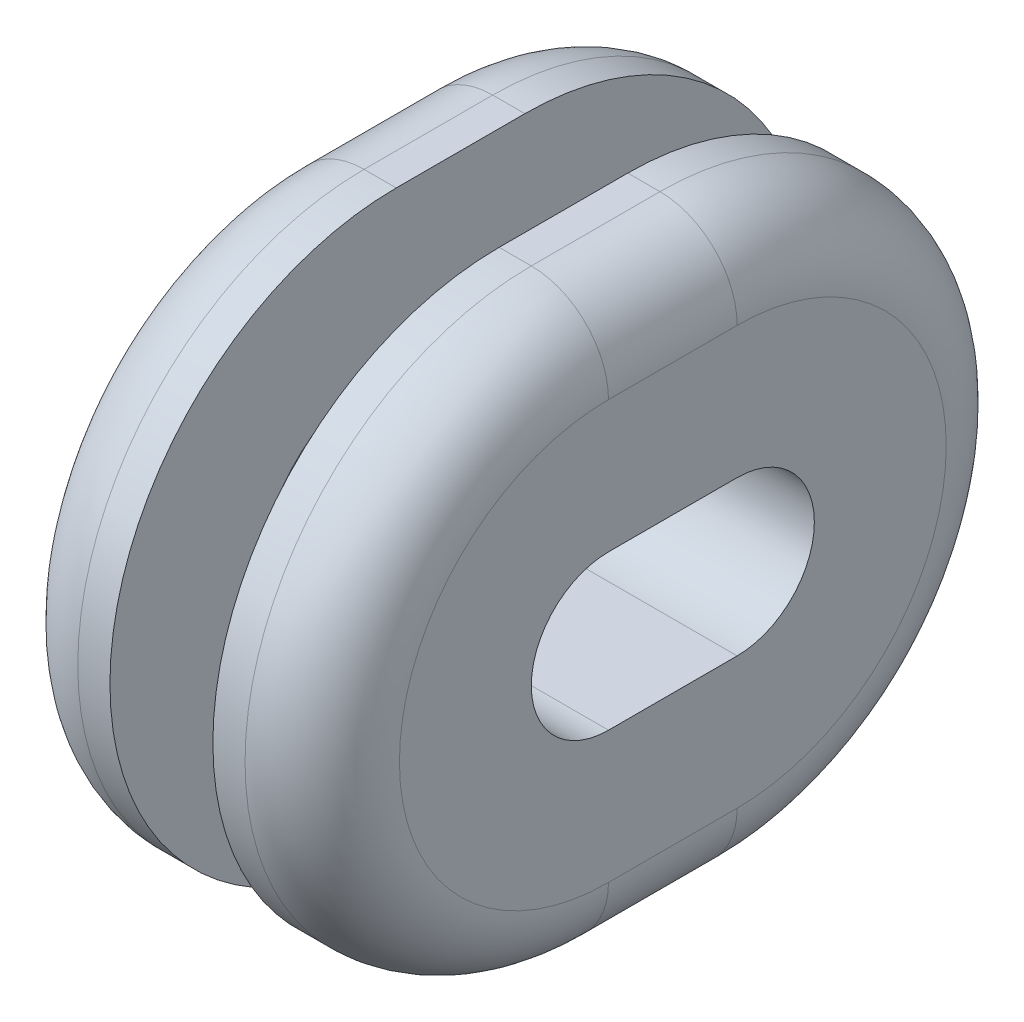
ISO-10303-21;
HEADER;
FILE_DESCRIPTION(('STEP AP214'),'2;1');
FILE_NAME('part.step','',(''),(''),'','','');
FILE_SCHEMA(('AUTOMOTIVE_DESIGN { 1 0 10303 214 1 1 1 1 }'));
ENDSEC;
DATA;
#1=APPLICATION_CONTEXT('core data for automotive mechanical design processes');
#2=APPLICATION_PROTOCOL_DEFINITION('international standard','automotive_design',2000,#1);
#3=PRODUCT_CONTEXT('',#1,'mechanical');
#4=PRODUCT('Part','Part','',(#3));
#5=PRODUCT_RELATED_PRODUCT_CATEGORY('part','',(#4));
#6=PRODUCT_DEFINITION_FORMATION('','',#4);
#7=PRODUCT_DEFINITION_CONTEXT('part definition',#1,'design');
#8=PRODUCT_DEFINITION('design','',#6,#7);
#9=PRODUCT_DEFINITION_SHAPE('','',#8);
#10=(LENGTH_UNIT() NAMED_UNIT(*) SI_UNIT(.MILLI.,.METRE.));
#11=(NAMED_UNIT(*) PLANE_ANGLE_UNIT() SI_UNIT($,.RADIAN.));
#12=(NAMED_UNIT(*) SI_UNIT($,.STERADIAN.) SOLID_ANGLE_UNIT());
#13=UNCERTAINTY_MEASURE_WITH_UNIT(LENGTH_MEASURE(1.E-05),#10,'distance_accuracy_value','');
#14=(GEOMETRIC_REPRESENTATION_CONTEXT(3) GLOBAL_UNCERTAINTY_ASSIGNED_CONTEXT((#13)) GLOBAL_UNIT_ASSIGNED_CONTEXT((#10,
#11,#12)) REPRESENTATION_CONTEXT('',''));
#15=CARTESIAN_POINT('',(0.,0.,0.));
#16=DIRECTION('',(0.,0.,1.));
#17=DIRECTION('',(1.,0.,0.));
#18=AXIS2_PLACEMENT_3D('',#15,#16,#17);
#19=CARTESIAN_POINT('',(0.,-1.2,-1.));
#20=DIRECTION('',(1.,0.,0.));
#21=DIRECTION('',(0.,0.,-1.));
#22=AXIS2_PLACEMENT_3D('',#19,#20,#21);
#23=CYLINDRICAL_SURFACE('',#22,4.45);
#24=DIRECTION('',(-1.,0.,0.));
#25=VECTOR('',#24,1.);
#26=CARTESIAN_POINT('',(-0.8,-5.65,-1.));
#27=LINE('',#26,#25);
#28=CARTESIAN_POINT('',(-0.8,-5.65,-1.));
#29=VERTEX_POINT('',#28);
#30=CARTESIAN_POINT('',(-1.3,-5.65,-1.));
#31=VERTEX_POINT('',#30);
#32=EDGE_CURVE('E368',#29,#31,#27,.T.);
#33=ORIENTED_EDGE('',*,*,#32,.T.);
#34=CARTESIAN_POINT('',(-1.3,-1.2,-1.));
#35=DIRECTION('',(1.,0.,0.));
#36=DIRECTION('',(0.,1.,0.));
#37=AXIS2_PLACEMENT_3D('',#34,#35,#36);
#38=CIRCLE('',#37,4.45);
#39=CARTESIAN_POINT('',(-1.3,3.25,-0.999999999999938));
#40=VERTEX_POINT('',#39);
#41=EDGE_CURVE('E42',#31,#40,#38,.T.);
#42=ORIENTED_EDGE('',*,*,#41,.T.);
#43=DIRECTION('',(-1.,0.,0.));
#44=VECTOR('',#43,1.);
#45=CARTESIAN_POINT('',(-0.8,3.25,-0.999999999999938));
#46=LINE('',#45,#44);
#47=CARTESIAN_POINT('',(-0.8,3.25,-0.999999999999938));
#48=VERTEX_POINT('',#47);
#49=EDGE_CURVE('E329',#48,#40,#46,.T.);
#50=ORIENTED_EDGE('',*,*,#49,.F.);
#51=CARTESIAN_POINT('',(-0.8,-1.2,-1.));
#52=DIRECTION('',(1.,0.,0.));
#53=DIRECTION('',(0.,0.,-1.));
#54=AXIS2_PLACEMENT_3D('',#51,#52,#53);
#55=CIRCLE('',#54,4.45);
#56=EDGE_CURVE('E198',#29,#48,#55,.T.);
#57=ORIENTED_EDGE('',*,*,#56,.F.);
#58=EDGE_LOOP('',(#33,#42,#50,#57));
#59=FACE_BOUND('',#58,.T.);
#60=ADVANCED_FACE('F33',(#59),#23,.T.);
#61=CARTESIAN_POINT('',(0.,-1.2,-1.));
#62=DIRECTION('',(1.,0.,0.));
#63=DIRECTION('',(0.,0.,-1.));
#64=AXIS2_PLACEMENT_3D('',#61,#62,#63);
#65=CYLINDRICAL_SURFACE('',#64,1.2);
#66=DIRECTION('',(1.,0.,0.));
#67=VECTOR('',#66,1.);
#68=CARTESIAN_POINT('',(-2.5,-2.4,-1.));
#69=LINE('',#68,#67);
#70=CARTESIAN_POINT('',(-2.5,-2.4,-1.));
#71=VERTEX_POINT('',#70);
#72=CARTESIAN_POINT('',(2.5,-2.4,-1.));
#73=VERTEX_POINT('',#72);
#74=EDGE_CURVE('E334',#71,#73,#69,.T.);
#75=ORIENTED_EDGE('',*,*,#74,.T.);
#76=CARTESIAN_POINT('',(2.5,-1.2,-1.));
#77=DIRECTION('',(1.,0.,0.));
#78=DIRECTION('',(0.,0.,-1.));
#79=AXIS2_PLACEMENT_3D('',#76,#77,#78);
#80=CIRCLE('',#79,1.2);
#81=CARTESIAN_POINT('',(2.5,0.,-0.999999999999983));
#82=VERTEX_POINT('',#81);
#83=EDGE_CURVE('E317',#73,#82,#80,.T.);
#84=ORIENTED_EDGE('',*,*,#83,.T.);
#85=DIRECTION('',(1.,0.,0.));
#86=VECTOR('',#85,1.);
#87=CARTESIAN_POINT('',(-2.5,0.,-0.999999999999983));
#88=LINE('',#87,#86);
#89=CARTESIAN_POINT('',(-2.5,0.,-0.999999999999983));
#90=VERTEX_POINT('',#89);
#91=EDGE_CURVE('E325',#90,#82,#88,.T.);
#92=ORIENTED_EDGE('',*,*,#91,.F.);
#93=CARTESIAN_POINT('',(-2.5,-1.2,-1.));
#94=DIRECTION('',(1.,0.,0.));
#95=DIRECTION('',(0.,0.,-1.));
#96=AXIS2_PLACEMENT_3D('',#93,#94,#95);
#97=CIRCLE('',#96,1.2);
#98=EDGE_CURVE('E336',#71,#90,#97,.T.);
#99=ORIENTED_EDGE('',*,*,#98,.F.);
#100=EDGE_LOOP('',(#75,#84,#92,#99));
#101=FACE_BOUND('',#100,.T.);
#102=ADVANCED_FACE('F332',(#101),#65,.F.);
#103=CARTESIAN_POINT('',(0.,-1.2,-1.));
#104=DIRECTION('',(1.,0.,0.));
#105=DIRECTION('',(0.,0.,-1.));
#106=AXIS2_PLACEMENT_3D('',#103,#104,#105);
#107=CYLINDRICAL_SURFACE('',#106,4.45);
#108=DIRECTION('',(-1.,0.,0.));
#109=VECTOR('',#108,1.);
#110=CARTESIAN_POINT('',(0.8,3.25,-0.999999999999938));
#111=LINE('',#110,#109);
#112=CARTESIAN_POINT('',(1.3,3.25,-0.999999999999938));
#113=VERTEX_POINT('',#112);
#114=CARTESIAN_POINT('',(0.8,3.25,-0.999999999999938));
#115=VERTEX_POINT('',#114);
#116=EDGE_CURVE('E330',#113,#115,#111,.T.);
#117=ORIENTED_EDGE('',*,*,#116,.F.);
#118=CARTESIAN_POINT('',(1.3,-1.2,-1.));
#119=DIRECTION('',(-1.,0.,0.));
#120=DIRECTION('',(0.,-1.,0.));
#121=AXIS2_PLACEMENT_3D('',#118,#119,#120);
#122=CIRCLE('',#121,4.45);
#123=CARTESIAN_POINT('',(1.3,-5.65,-1.));
#124=VERTEX_POINT('',#123);
#125=EDGE_CURVE('E55',#113,#124,#122,.T.);
#126=ORIENTED_EDGE('',*,*,#125,.T.);
#127=DIRECTION('',(-1.,0.,0.));
#128=VECTOR('',#127,1.);
#129=CARTESIAN_POINT('',(0.8,-5.65,-1.));
#130=LINE('',#129,#128);
#131=CARTESIAN_POINT('',(0.8,-5.65,-1.));
#132=VERTEX_POINT('',#131);
#133=EDGE_CURVE('E295',#124,#132,#130,.T.);
#134=ORIENTED_EDGE('',*,*,#133,.T.);
#135=CARTESIAN_POINT('',(0.8,-1.2,-1.));
#136=DIRECTION('',(1.,0.,0.));
#137=DIRECTION('',(0.,0.,-1.));
#138=AXIS2_PLACEMENT_3D('',#135,#136,#137);
#139=CIRCLE('',#138,4.45);
#140=EDGE_CURVE('E337',#132,#115,#139,.T.);
#141=ORIENTED_EDGE('',*,*,#140,.T.);
#142=EDGE_LOOP('',(#117,#126,#134,#141));
#143=FACE_BOUND('',#142,.T.);
#144=ADVANCED_FACE('F417',(#143),#107,.T.);
#145=CARTESIAN_POINT('',(0.,-1.2,-1.));
#146=DIRECTION('',(1.,0.,0.));
#147=DIRECTION('',(0.,0.,-1.));
#148=AXIS2_PLACEMENT_3D('',#145,#146,#147);
#149=CYLINDRICAL_SURFACE('',#148,2.2);
#150=DIRECTION('',(-1.,0.,0.));
#151=VECTOR('',#150,1.);
#152=CARTESIAN_POINT('',(-0.8,-3.4,-1.));
#153=LINE('',#152,#151);
#154=CARTESIAN_POINT('',(0.8,-3.4,-1.));
#155=VERTEX_POINT('',#154);
#156=CARTESIAN_POINT('',(-0.8,-3.4,-1.));
#157=VERTEX_POINT('',#156);
#158=EDGE_CURVE('E182',#155,#157,#153,.T.);
#159=ORIENTED_EDGE('',*,*,#158,.T.);
#160=CARTESIAN_POINT('',(-0.8,-1.2,-1.));
#161=DIRECTION('',(1.,0.,0.));
#162=DIRECTION('',(0.,0.,-1.));
#163=AXIS2_PLACEMENT_3D('',#160,#161,#162);
#164=CIRCLE('',#163,2.2);
#165=CARTESIAN_POINT('',(-0.8,1.,-0.999999999999969));
#166=VERTEX_POINT('',#165);
#167=EDGE_CURVE('E345',#157,#166,#164,.T.);
#168=ORIENTED_EDGE('',*,*,#167,.T.);
#169=DIRECTION('',(-1.,0.,0.));
#170=VECTOR('',#169,1.);
#171=CARTESIAN_POINT('',(-0.8,1.,-0.999999999999969));
#172=LINE('',#171,#170);
#173=CARTESIAN_POINT('',(0.8,1.,-0.999999999999969));
#174=VERTEX_POINT('',#173);
#175=EDGE_CURVE('E350',#174,#166,#172,.T.);
#176=ORIENTED_EDGE('',*,*,#175,.F.);
#177=CARTESIAN_POINT('',(0.8,-1.2,-1.));
#178=DIRECTION('',(1.,0.,0.));
#179=DIRECTION('',(0.,0.,-1.));
#180=AXIS2_PLACEMENT_3D('',#177,#178,#179);
#181=CIRCLE('',#180,2.2);
#182=EDGE_CURVE('E340',#155,#174,#181,.T.);
#183=ORIENTED_EDGE('',*,*,#182,.F.);
#184=EDGE_LOOP('',(#159,#168,#176,#183));
#185=FACE_BOUND('',#184,.T.);
#186=ADVANCED_FACE('F408',(#185),#149,.T.);
#187=CARTESIAN_POINT('',(-0.8,-5.65,1.));
#188=DIRECTION('',(0.,-1.,0.));
#189=DIRECTION('',(0.,0.,-1.));
#190=AXIS2_PLACEMENT_3D('',#187,#188,#189);
#191=PLANE('',#190);
#192=DIRECTION('',(-1.,0.,0.));
#193=VECTOR('',#192,1.);
#194=CARTESIAN_POINT('',(-0.8,-5.65,1.));
#195=LINE('',#194,#193);
#196=CARTESIAN_POINT('',(-0.8,-5.65,1.));
#197=VERTEX_POINT('',#196);
#198=CARTESIAN_POINT('',(-1.3,-5.65,1.));
#199=VERTEX_POINT('',#198);
#200=EDGE_CURVE('E178',#197,#199,#195,.T.);
#201=ORIENTED_EDGE('',*,*,#200,.T.);
#202=DIRECTION('',(0.,0.,-1.));
#203=VECTOR('',#202,1.);
#204=CARTESIAN_POINT('',(-1.3,-5.65,-0.999999999999999));
#205=LINE('',#204,#203);
#206=EDGE_CURVE('E231',#199,#31,#205,.T.);
#207=ORIENTED_EDGE('',*,*,#206,.T.);
#208=ORIENTED_EDGE('',*,*,#32,.F.);
#209=DIRECTION('',(0.,0.,-1.));
#210=VECTOR('',#209,1.);
#211=CARTESIAN_POINT('',(-0.8,-5.65,1.));
#212=LINE('',#211,#210);
#213=EDGE_CURVE('E353',#197,#29,#212,.T.);
#214=ORIENTED_EDGE('',*,*,#213,.F.);
#215=EDGE_LOOP('',(#201,#207,#208,#214));
#216=FACE_BOUND('',#215,.T.);
#217=ADVANCED_FACE('F400',(#216),#191,.T.);
#218=CARTESIAN_POINT('',(-2.5,-2.4,1.));
#219=DIRECTION('',(0.,1.,0.));
#220=DIRECTION('',(0.,0.,1.));
#221=AXIS2_PLACEMENT_3D('',#218,#219,#220);
#222=PLANE('',#221);
#223=DIRECTION('',(1.,0.,0.));
#224=VECTOR('',#223,1.);
#225=CARTESIAN_POINT('',(-2.5,-2.4,1.));
#226=LINE('',#225,#224);
#227=CARTESIAN_POINT('',(-2.5,-2.4,1.));
#228=VERTEX_POINT('',#227);
#229=CARTESIAN_POINT('',(2.5,-2.4,1.));
#230=VERTEX_POINT('',#229);
#231=EDGE_CURVE('E302',#228,#230,#226,.T.);
#232=ORIENTED_EDGE('',*,*,#231,.T.);
#233=DIRECTION('',(0.,0.,-1.));
#234=VECTOR('',#233,1.);
#235=CARTESIAN_POINT('',(2.5,-2.4,1.));
#236=LINE('',#235,#234);
#237=EDGE_CURVE('E358',#230,#73,#236,.T.);
#238=ORIENTED_EDGE('',*,*,#237,.T.);
#239=ORIENTED_EDGE('',*,*,#74,.F.);
#240=DIRECTION('',(0.,0.,-1.));
#241=VECTOR('',#240,1.);
#242=CARTESIAN_POINT('',(-2.5,-2.4,1.));
#243=LINE('',#242,#241);
#244=EDGE_CURVE('E355',#228,#71,#243,.T.);
#245=ORIENTED_EDGE('',*,*,#244,.F.);
#246=EDGE_LOOP('',(#232,#238,#239,#245));
#247=FACE_BOUND('',#246,.T.);
#248=ADVANCED_FACE('F398',(#247),#222,.T.);
#249=CARTESIAN_POINT('',(0.8,-5.65,1.));
#250=DIRECTION('',(0.,-1.,0.));
#251=DIRECTION('',(0.,0.,-1.));
#252=AXIS2_PLACEMENT_3D('',#249,#250,#251);
#253=PLANE('',#252);
#254=ORIENTED_EDGE('',*,*,#133,.F.);
#255=DIRECTION('',(0.,0.,-1.));
#256=VECTOR('',#255,1.);
#257=CARTESIAN_POINT('',(1.3,-5.65,1.));
#258=LINE('',#257,#256);
#259=CARTESIAN_POINT('',(1.3,-5.65,1.));
#260=VERTEX_POINT('',#259);
#261=EDGE_CURVE('E258',#124,#260,#258,.F.);
#262=ORIENTED_EDGE('',*,*,#261,.T.);
#263=DIRECTION('',(-1.,0.,0.));
#264=VECTOR('',#263,1.);
#265=CARTESIAN_POINT('',(0.8,-5.65,1.));
#266=LINE('',#265,#264);
#267=CARTESIAN_POINT('',(0.8,-5.65,1.));
#268=VERTEX_POINT('',#267);
#269=EDGE_CURVE('E203',#260,#268,#266,.T.);
#270=ORIENTED_EDGE('',*,*,#269,.T.);
#271=DIRECTION('',(0.,0.,-1.));
#272=VECTOR('',#271,1.);
#273=CARTESIAN_POINT('',(0.8,-5.65,1.));
#274=LINE('',#273,#272);
#275=EDGE_CURVE('E360',#268,#132,#274,.T.);
#276=ORIENTED_EDGE('',*,*,#275,.T.);
#277=EDGE_LOOP('',(#254,#262,#270,#276));
#278=FACE_BOUND('',#277,.T.);
#279=ADVANCED_FACE('F292',(#278),#253,.T.);
#280=CARTESIAN_POINT('',(-0.8,-3.4,1.));
#281=DIRECTION('',(0.,-1.,0.));
#282=DIRECTION('',(0.,0.,-1.));
#283=AXIS2_PLACEMENT_3D('',#280,#281,#282);
#284=PLANE('',#283);
#285=DIRECTION('',(-1.,0.,0.));
#286=VECTOR('',#285,1.);
#287=CARTESIAN_POINT('',(-0.8,-3.4,1.));
#288=LINE('',#287,#286);
#289=CARTESIAN_POINT('',(0.8,-3.4,1.));
#290=VERTEX_POINT('',#289);
#291=CARTESIAN_POINT('',(-0.8,-3.4,1.));
#292=VERTEX_POINT('',#291);
#293=EDGE_CURVE('E199',#290,#292,#288,.T.);
#294=ORIENTED_EDGE('',*,*,#293,.T.);
#295=DIRECTION('',(0.,0.,-1.));
#296=VECTOR('',#295,1.);
#297=CARTESIAN_POINT('',(-0.8,-3.4,1.));
#298=LINE('',#297,#296);
#299=EDGE_CURVE('E365',#292,#157,#298,.T.);
#300=ORIENTED_EDGE('',*,*,#299,.T.);
#301=ORIENTED_EDGE('',*,*,#158,.F.);
#302=DIRECTION('',(0.,0.,-1.));
#303=VECTOR('',#302,1.);
#304=CARTESIAN_POINT('',(0.8,-3.4,1.));
#305=LINE('',#304,#303);
#306=EDGE_CURVE('E362',#290,#155,#305,.T.);
#307=ORIENTED_EDGE('',*,*,#306,.F.);
#308=EDGE_LOOP('',(#294,#300,#301,#307));
#309=FACE_BOUND('',#308,.T.);
#310=ADVANCED_FACE('F406',(#309),#284,.T.);
#311=CARTESIAN_POINT('',(0.,-1.2,1.));
#312=DIRECTION('',(1.,0.,0.));
#313=DIRECTION('',(0.,0.,-1.));
#314=AXIS2_PLACEMENT_3D('',#311,#312,#313);
#315=CYLINDRICAL_SURFACE('',#314,4.45);
#316=DIRECTION('',(-1.,0.,0.));
#317=VECTOR('',#316,1.);
#318=CARTESIAN_POINT('',(-0.8,3.25,1.));
#319=LINE('',#318,#317);
#320=CARTESIAN_POINT('',(-0.8,3.25,1.));
#321=VERTEX_POINT('',#320);
#322=CARTESIAN_POINT('',(-1.3,3.25,1.));
#323=VERTEX_POINT('',#322);
#324=EDGE_CURVE('E175',#321,#323,#319,.T.);
#325=ORIENTED_EDGE('',*,*,#324,.T.);
#326=CARTESIAN_POINT('',(-1.3,-1.2,1.));
#327=DIRECTION('',(1.,0.,0.));
#328=DIRECTION('',(0.,1.,0.));
#329=AXIS2_PLACEMENT_3D('',#326,#327,#328);
#330=CIRCLE('',#329,4.45);
#331=EDGE_CURVE('E243',#323,#199,#330,.T.);
#332=ORIENTED_EDGE('',*,*,#331,.T.);
#333=ORIENTED_EDGE('',*,*,#200,.F.);
#334=CARTESIAN_POINT('',(-0.8,-1.2,1.));
#335=DIRECTION('',(1.,0.,0.));
#336=DIRECTION('',(0.,0.,-1.));
#337=AXIS2_PLACEMENT_3D('',#334,#335,#336);
#338=CIRCLE('',#337,4.45);
#339=EDGE_CURVE('E172',#321,#197,#338,.T.);
#340=ORIENTED_EDGE('',*,*,#339,.F.);
#341=EDGE_LOOP('',(#325,#332,#333,#340));
#342=FACE_BOUND('',#341,.T.);
#343=ADVANCED_FACE('F174',(#342),#315,.T.);
#344=CARTESIAN_POINT('',(0.,-1.2,1.));
#345=DIRECTION('',(1.,0.,0.));
#346=DIRECTION('',(0.,0.,-1.));
#347=AXIS2_PLACEMENT_3D('',#344,#345,#346);
#348=CYLINDRICAL_SURFACE('',#347,1.2);
#349=DIRECTION('',(1.,0.,0.));
#350=VECTOR('',#349,1.);
#351=CARTESIAN_POINT('',(-2.5,0.,1.));
#352=LINE('',#351,#350);
#353=CARTESIAN_POINT('',(-2.5,0.,1.));
#354=VERTEX_POINT('',#353);
#355=CARTESIAN_POINT('',(2.5,0.,1.));
#356=VERTEX_POINT('',#355);
#357=EDGE_CURVE('E192',#354,#356,#352,.T.);
#358=ORIENTED_EDGE('',*,*,#357,.T.);
#359=CARTESIAN_POINT('',(2.5,-1.2,1.));
#360=DIRECTION('',(1.,0.,0.));
#361=DIRECTION('',(0.,0.,-1.));
#362=AXIS2_PLACEMENT_3D('',#359,#360,#361);
#363=CIRCLE('',#362,1.2);
#364=EDGE_CURVE('E320',#356,#230,#363,.T.);
#365=ORIENTED_EDGE('',*,*,#364,.T.);
#366=ORIENTED_EDGE('',*,*,#231,.F.);
#367=CARTESIAN_POINT('',(-2.5,-1.2,1.));
#368=DIRECTION('',(1.,0.,0.));
#369=DIRECTION('',(0.,0.,-1.));
#370=AXIS2_PLACEMENT_3D('',#367,#368,#369);
#371=CIRCLE('',#370,1.2);
#372=EDGE_CURVE('E183',#354,#228,#371,.T.);
#373=ORIENTED_EDGE('',*,*,#372,.F.);
#374=EDGE_LOOP('',(#358,#365,#366,#373));
#375=FACE_BOUND('',#374,.T.);
#376=ADVANCED_FACE('F393',(#375),#348,.F.);
#377=CARTESIAN_POINT('',(0.,-1.2,1.));
#378=DIRECTION('',(1.,0.,0.));
#379=DIRECTION('',(0.,0.,-1.));
#380=AXIS2_PLACEMENT_3D('',#377,#378,#379);
#381=CYLINDRICAL_SURFACE('',#380,4.45);
#382=ORIENTED_EDGE('',*,*,#269,.F.);
#383=CARTESIAN_POINT('',(1.3,-1.2,1.));
#384=DIRECTION('',(-1.,0.,0.));
#385=DIRECTION('',(0.,-1.,0.));
#386=AXIS2_PLACEMENT_3D('',#383,#384,#385);
#387=CIRCLE('',#386,4.45);
#388=CARTESIAN_POINT('',(1.3,3.25,1.));
#389=VERTEX_POINT('',#388);
#390=EDGE_CURVE('E255',#260,#389,#387,.T.);
#391=ORIENTED_EDGE('',*,*,#390,.T.);
#392=DIRECTION('',(-1.,0.,0.));
#393=VECTOR('',#392,1.);
#394=CARTESIAN_POINT('',(0.8,3.25,1.));
#395=LINE('',#394,#393);
#396=CARTESIAN_POINT('',(0.8,3.25,1.));
#397=VERTEX_POINT('',#396);
#398=EDGE_CURVE('E390',#389,#397,#395,.T.);
#399=ORIENTED_EDGE('',*,*,#398,.T.);
#400=CARTESIAN_POINT('',(0.8,-1.2,1.));
#401=DIRECTION('',(1.,0.,0.));
#402=DIRECTION('',(0.,0.,-1.));
#403=AXIS2_PLACEMENT_3D('',#400,#401,#402);
#404=CIRCLE('',#403,4.45);
#405=EDGE_CURVE('E301',#397,#268,#404,.T.);
#406=ORIENTED_EDGE('',*,*,#405,.T.);
#407=EDGE_LOOP('',(#382,#391,#399,#406));
#408=FACE_BOUND('',#407,.T.);
#409=ADVANCED_FACE('F299',(#408),#381,.T.);
#410=CARTESIAN_POINT('',(0.,-1.2,1.));
#411=DIRECTION('',(1.,0.,0.));
#412=DIRECTION('',(0.,0.,-1.));
#413=AXIS2_PLACEMENT_3D('',#410,#411,#412);
#414=CYLINDRICAL_SURFACE('',#413,2.2);
#415=DIRECTION('',(-1.,0.,0.));
#416=VECTOR('',#415,1.);
#417=CARTESIAN_POINT('',(-0.8,1.,1.));
#418=LINE('',#417,#416);
#419=CARTESIAN_POINT('',(0.8,1.,1.));
#420=VERTEX_POINT('',#419);
#421=CARTESIAN_POINT('',(-0.8,1.,1.));
#422=VERTEX_POINT('',#421);
#423=EDGE_CURVE('E215',#420,#422,#418,.T.);
#424=ORIENTED_EDGE('',*,*,#423,.T.);
#425=CARTESIAN_POINT('',(-0.8,-1.2,1.));
#426=DIRECTION('',(1.,0.,0.));
#427=DIRECTION('',(0.,0.,-1.));
#428=AXIS2_PLACEMENT_3D('',#425,#426,#427);
#429=CIRCLE('',#428,2.2);
#430=EDGE_CURVE('E382',#422,#292,#429,.T.);
#431=ORIENTED_EDGE('',*,*,#430,.T.);
#432=ORIENTED_EDGE('',*,*,#293,.F.);
#433=CARTESIAN_POINT('',(0.8,-1.2,1.));
#434=DIRECTION('',(1.,0.,0.));
#435=DIRECTION('',(0.,0.,-1.));
#436=AXIS2_PLACEMENT_3D('',#433,#434,#435);
#437=CIRCLE('',#436,2.2);
#438=EDGE_CURVE('E379',#420,#290,#437,.T.);
#439=ORIENTED_EDGE('',*,*,#438,.F.);
#440=EDGE_LOOP('',(#424,#431,#432,#439));
#441=FACE_BOUND('',#440,.T.);
#442=ADVANCED_FACE('F514',(#441),#414,.T.);
#443=CARTESIAN_POINT('',(-0.8,1.,1.));
#444=DIRECTION('',(-1.,0.,0.));
#445=DIRECTION('',(0.,0.,1.));
#446=AXIS2_PLACEMENT_3D('',#443,#444,#445);
#447=PLANE('',#446);
#448=DIRECTION('',(0.,0.,-1.));
#449=VECTOR('',#448,1.);
#450=CARTESIAN_POINT('',(-0.8,3.25,1.));
#451=LINE('',#450,#449);
#452=EDGE_CURVE('E188',#321,#48,#451,.T.);
#453=ORIENTED_EDGE('',*,*,#452,.F.);
#454=ORIENTED_EDGE('',*,*,#339,.T.);
#455=ORIENTED_EDGE('',*,*,#213,.T.);
#456=ORIENTED_EDGE('',*,*,#56,.T.);
#457=EDGE_LOOP('',(#453,#454,#455,#456));
#458=FACE_BOUND('',#457,.T.);
#459=DIRECTION('',(0.,0.,-1.));
#460=VECTOR('',#459,1.);
#461=CARTESIAN_POINT('',(-0.8,1.,1.));
#462=LINE('',#461,#460);
#463=EDGE_CURVE('E212',#422,#166,#462,.T.);
#464=ORIENTED_EDGE('',*,*,#463,.T.);
#465=ORIENTED_EDGE('',*,*,#167,.F.);
#466=ORIENTED_EDGE('',*,*,#299,.F.);
#467=ORIENTED_EDGE('',*,*,#430,.F.);
#468=EDGE_LOOP('',(#464,#465,#466,#467));
#469=FACE_BOUND('',#468,.T.);
#470=ADVANCED_FACE('F196',(#458,#469),#447,.F.);
#471=CARTESIAN_POINT('',(-0.8,3.25,1.));
#472=DIRECTION('',(0.,-1.,0.));
#473=DIRECTION('',(0.,0.,-1.));
#474=AXIS2_PLACEMENT_3D('',#471,#472,#473);
#475=PLANE('',#474);
#476=ORIENTED_EDGE('',*,*,#49,.T.);
#477=DIRECTION('',(0.,0.,-1.));
#478=VECTOR('',#477,1.);
#479=CARTESIAN_POINT('',(-1.3,3.25,1.));
#480=LINE('',#479,#478);
#481=EDGE_CURVE('E191',#40,#323,#480,.F.);
#482=ORIENTED_EDGE('',*,*,#481,.T.);
#483=ORIENTED_EDGE('',*,*,#324,.F.);
#484=ORIENTED_EDGE('',*,*,#452,.T.);
#485=EDGE_LOOP('',(#476,#482,#483,#484));
#486=FACE_BOUND('',#485,.T.);
#487=ADVANCED_FACE('F187',(#486),#475,.F.);
#488=CARTESIAN_POINT('',(-2.5,3.25,1.));
#489=DIRECTION('',(1.,0.,0.));
#490=DIRECTION('',(0.,1.,0.));
#491=AXIS2_PLACEMENT_3D('',#488,#489,#490);
#492=PLANE('',#491);
#493=CARTESIAN_POINT('',(-2.5,-1.2,-1.));
#494=DIRECTION('',(1.,0.,0.));
#495=DIRECTION('',(0.,1.,0.));
#496=AXIS2_PLACEMENT_3D('',#493,#494,#495);
#497=CIRCLE('',#496,3.25);
#498=CARTESIAN_POINT('',(-2.5,2.05,-0.999999999999938));
#499=VERTEX_POINT('',#498);
#500=CARTESIAN_POINT('',(-2.5,-4.45,-0.999999999999999));
#501=VERTEX_POINT('',#500);
#502=EDGE_CURVE('E234',#499,#501,#497,.F.);
#503=ORIENTED_EDGE('',*,*,#502,.T.);
#504=DIRECTION('',(0.,0.,-1.));
#505=VECTOR('',#504,1.);
#506=CARTESIAN_POINT('',(-2.5,-4.45,1.));
#507=LINE('',#506,#505);
#508=CARTESIAN_POINT('',(-2.5,-4.45,1.));
#509=VERTEX_POINT('',#508);
#510=EDGE_CURVE('E240',#501,#509,#507,.F.);
#511=ORIENTED_EDGE('',*,*,#510,.T.);
#512=CARTESIAN_POINT('',(-2.5,-1.2,1.));
#513=DIRECTION('',(1.,0.,0.));
#514=DIRECTION('',(0.,1.,0.));
#515=AXIS2_PLACEMENT_3D('',#512,#513,#514);
#516=CIRCLE('',#515,3.25);
#517=CARTESIAN_POINT('',(-2.5,2.05,1.));
#518=VERTEX_POINT('',#517);
#519=EDGE_CURVE('E238',#509,#518,#516,.F.);
#520=ORIENTED_EDGE('',*,*,#519,.T.);
#521=DIRECTION('',(0.,0.,-1.));
#522=VECTOR('',#521,1.);
#523=CARTESIAN_POINT('',(-2.5,2.05,1.));
#524=LINE('',#523,#522);
#525=EDGE_CURVE('E236',#518,#499,#524,.T.);
#526=ORIENTED_EDGE('',*,*,#525,.T.);
#527=EDGE_LOOP('',(#503,#511,#520,#526));
#528=FACE_BOUND('',#527,.T.);
#529=DIRECTION('',(0.,0.,-1.));
#530=VECTOR('',#529,1.);
#531=CARTESIAN_POINT('',(-2.5,0.,1.));
#532=LINE('',#531,#530);
#533=EDGE_CURVE('E200',#354,#90,#532,.T.);
#534=ORIENTED_EDGE('',*,*,#533,.F.);
#535=ORIENTED_EDGE('',*,*,#372,.T.);
#536=ORIENTED_EDGE('',*,*,#244,.T.);
#537=ORIENTED_EDGE('',*,*,#98,.T.);
#538=EDGE_LOOP('',(#534,#535,#536,#537));
#539=FACE_BOUND('',#538,.T.);
#540=ADVANCED_FACE('F396',(#528,#539),#492,.F.);
#541=CARTESIAN_POINT('',(-2.5,0.,1.));
#542=DIRECTION('',(0.,1.,0.));
#543=DIRECTION('',(0.,0.,1.));
#544=AXIS2_PLACEMENT_3D('',#541,#542,#543);
#545=PLANE('',#544);
#546=ORIENTED_EDGE('',*,*,#533,.T.);
#547=ORIENTED_EDGE('',*,*,#91,.T.);
#548=DIRECTION('',(0.,0.,-1.));
#549=VECTOR('',#548,1.);
#550=CARTESIAN_POINT('',(2.5,0.,1.));
#551=LINE('',#550,#549);
#552=EDGE_CURVE('E205',#356,#82,#551,.T.);
#553=ORIENTED_EDGE('',*,*,#552,.F.);
#554=ORIENTED_EDGE('',*,*,#357,.F.);
#555=EDGE_LOOP('',(#546,#547,#553,#554));
#556=FACE_BOUND('',#555,.T.);
#557=ADVANCED_FACE('F312',(#556),#545,.F.);
#558=CARTESIAN_POINT('',(2.5,3.25,1.));
#559=DIRECTION('',(-1.,0.,0.));
#560=DIRECTION('',(0.,-1.,0.));
#561=AXIS2_PLACEMENT_3D('',#558,#559,#560);
#562=PLANE('',#561);
#563=DIRECTION('',(0.,0.,-1.));
#564=VECTOR('',#563,1.);
#565=CARTESIAN_POINT('',(2.5,2.05,1.));
#566=LINE('',#565,#564);
#567=CARTESIAN_POINT('',(2.5,2.05,-0.999999999999954));
#568=VERTEX_POINT('',#567);
#569=CARTESIAN_POINT('',(2.5,2.05,1.));
#570=VERTEX_POINT('',#569);
#571=EDGE_CURVE('E246',#568,#570,#566,.F.);
#572=ORIENTED_EDGE('',*,*,#571,.T.);
#573=CARTESIAN_POINT('',(2.5,-1.2,1.));
#574=DIRECTION('',(-1.,0.,0.));
#575=DIRECTION('',(0.,-1.,0.));
#576=AXIS2_PLACEMENT_3D('',#573,#574,#575);
#577=CIRCLE('',#576,3.25);
#578=CARTESIAN_POINT('',(2.5,-4.45,1.));
#579=VERTEX_POINT('',#578);
#580=EDGE_CURVE('E252',#570,#579,#577,.F.);
#581=ORIENTED_EDGE('',*,*,#580,.T.);
#582=DIRECTION('',(0.,0.,-1.));
#583=VECTOR('',#582,1.);
#584=CARTESIAN_POINT('',(2.5,-4.45,-0.999999999999999));
#585=LINE('',#584,#583);
#586=CARTESIAN_POINT('',(2.5,-4.45,-0.999999999999999));
#587=VERTEX_POINT('',#586);
#588=EDGE_CURVE('E250',#579,#587,#585,.T.);
#589=ORIENTED_EDGE('',*,*,#588,.T.);
#590=CARTESIAN_POINT('',(2.5,-1.2,-1.));
#591=DIRECTION('',(-1.,0.,0.));
#592=DIRECTION('',(0.,-1.,0.));
#593=AXIS2_PLACEMENT_3D('',#590,#591,#592);
#594=CIRCLE('',#593,3.25);
#595=EDGE_CURVE('E248',#587,#568,#594,.F.);
#596=ORIENTED_EDGE('',*,*,#595,.T.);
#597=EDGE_LOOP('',(#572,#581,#589,#596));
#598=FACE_BOUND('',#597,.T.);
#599=ORIENTED_EDGE('',*,*,#552,.T.);
#600=ORIENTED_EDGE('',*,*,#83,.F.);
#601=ORIENTED_EDGE('',*,*,#237,.F.);
#602=ORIENTED_EDGE('',*,*,#364,.F.);
#603=EDGE_LOOP('',(#599,#600,#601,#602));
#604=FACE_BOUND('',#603,.T.);
#605=ADVANCED_FACE('F308',(#598,#604),#562,.F.);
#606=CARTESIAN_POINT('',(0.8,3.25,1.));
#607=DIRECTION('',(0.,-1.,0.));
#608=DIRECTION('',(0.,0.,-1.));
#609=AXIS2_PLACEMENT_3D('',#606,#607,#608);
#610=PLANE('',#609);
#611=ORIENTED_EDGE('',*,*,#398,.F.);
#612=DIRECTION('',(0.,0.,-1.));
#613=VECTOR('',#612,1.);
#614=CARTESIAN_POINT('',(1.3,3.25,1.));
#615=LINE('',#614,#613);
#616=EDGE_CURVE('E11',#389,#113,#615,.T.);
#617=ORIENTED_EDGE('',*,*,#616,.T.);
#618=ORIENTED_EDGE('',*,*,#116,.T.);
#619=DIRECTION('',(0.,0.,-1.));
#620=VECTOR('',#619,1.);
#621=CARTESIAN_POINT('',(0.8,3.25,1.));
#622=LINE('',#621,#620);
#623=EDGE_CURVE('E221',#397,#115,#622,.T.);
#624=ORIENTED_EDGE('',*,*,#623,.F.);
#625=EDGE_LOOP('',(#611,#617,#618,#624));
#626=FACE_BOUND('',#625,.T.);
#627=ADVANCED_FACE('F311',(#626),#610,.F.);
#628=CARTESIAN_POINT('',(0.8,1.,1.));
#629=DIRECTION('',(1.,0.,0.));
#630=DIRECTION('',(0.,0.,-1.));
#631=AXIS2_PLACEMENT_3D('',#628,#629,#630);
#632=PLANE('',#631);
#633=DIRECTION('',(0.,0.,-1.));
#634=VECTOR('',#633,1.);
#635=CARTESIAN_POINT('',(0.8,1.,1.));
#636=LINE('',#635,#634);
#637=EDGE_CURVE('E214',#420,#174,#636,.T.);
#638=ORIENTED_EDGE('',*,*,#637,.F.);
#639=ORIENTED_EDGE('',*,*,#438,.T.);
#640=ORIENTED_EDGE('',*,*,#306,.T.);
#641=ORIENTED_EDGE('',*,*,#182,.T.);
#642=EDGE_LOOP('',(#638,#639,#640,#641));
#643=FACE_BOUND('',#642,.T.);
#644=ORIENTED_EDGE('',*,*,#623,.T.);
#645=ORIENTED_EDGE('',*,*,#140,.F.);
#646=ORIENTED_EDGE('',*,*,#275,.F.);
#647=ORIENTED_EDGE('',*,*,#405,.F.);
#648=EDGE_LOOP('',(#644,#645,#646,#647));
#649=FACE_BOUND('',#648,.T.);
#650=ADVANCED_FACE('F470',(#643,#649),#632,.F.);
#651=CARTESIAN_POINT('',(-0.8,1.,1.));
#652=DIRECTION('',(0.,-1.,0.));
#653=DIRECTION('',(0.,0.,-1.));
#654=AXIS2_PLACEMENT_3D('',#651,#652,#653);
#655=PLANE('',#654);
#656=ORIENTED_EDGE('',*,*,#637,.T.);
#657=ORIENTED_EDGE('',*,*,#175,.T.);
#658=ORIENTED_EDGE('',*,*,#463,.F.);
#659=ORIENTED_EDGE('',*,*,#423,.F.);
#660=EDGE_LOOP('',(#656,#657,#658,#659));
#661=FACE_BOUND('',#660,.T.);
#662=ADVANCED_FACE('F436',(#661),#655,.F.);
#663=CARTESIAN_POINT('',(-1.3,2.05,1.));
#664=DIRECTION('',(0.,0.,-1.));
#665=DIRECTION('',(-1.,0.,0.));
#666=AXIS2_PLACEMENT_3D('',#663,#664,#665);
#667=CYLINDRICAL_SURFACE('',#666,1.2);
#668=CARTESIAN_POINT('',(-1.3,2.05,-0.999999999999938));
#669=DIRECTION('',(0.,0.,-1.));
#670=DIRECTION('',(-1.,0.,0.));
#671=AXIS2_PLACEMENT_3D('',#668,#669,#670);
#672=CIRCLE('',#671,1.2);
#673=EDGE_CURVE('E266',#499,#40,#672,.T.);
#674=ORIENTED_EDGE('',*,*,#673,.F.);
#675=ORIENTED_EDGE('',*,*,#525,.F.);
#676=CARTESIAN_POINT('',(-1.3,2.05,1.));
#677=DIRECTION('',(0.,0.,1.));
#678=DIRECTION('',(1.,0.,0.));
#679=AXIS2_PLACEMENT_3D('',#676,#677,#678);
#680=CIRCLE('',#679,1.2);
#681=EDGE_CURVE('E193',#323,#518,#680,.T.);
#682=ORIENTED_EDGE('',*,*,#681,.F.);
#683=ORIENTED_EDGE('',*,*,#481,.F.);
#684=EDGE_LOOP('',(#674,#675,#682,#683));
#685=FACE_BOUND('',#684,.T.);
#686=ADVANCED_FACE('F432',(#685),#667,.T.);
#687=CARTESIAN_POINT('',(-1.3,-1.2,1.));
#688=DIRECTION('',(1.,0.,0.));
#689=DIRECTION('',(0.,1.,0.));
#690=AXIS2_PLACEMENT_3D('',#687,#688,#689);
#691=TOROIDAL_SURFACE('',#690,3.25,1.2);
#692=ORIENTED_EDGE('',*,*,#681,.T.);
#693=ORIENTED_EDGE('',*,*,#519,.F.);
#694=CARTESIAN_POINT('',(-1.3,-4.45,1.));
#695=DIRECTION('',(0.,0.,-1.));
#696=DIRECTION('',(-1.,0.,0.));
#697=AXIS2_PLACEMENT_3D('',#694,#695,#696);
#698=CIRCLE('',#697,1.2);
#699=EDGE_CURVE('E264',#199,#509,#698,.T.);
#700=ORIENTED_EDGE('',*,*,#699,.F.);
#701=ORIENTED_EDGE('',*,*,#331,.F.);
#702=EDGE_LOOP('',(#692,#693,#700,#701));
#703=FACE_BOUND('',#702,.T.);
#704=ADVANCED_FACE('F428',(#703),#691,.T.);
#705=CARTESIAN_POINT('',(-1.3,-1.2,-1.));
#706=DIRECTION('',(1.,0.,0.));
#707=DIRECTION('',(0.,1.,0.));
#708=AXIS2_PLACEMENT_3D('',#705,#706,#707);
#709=TOROIDAL_SURFACE('',#708,3.25,1.2);
#710=ORIENTED_EDGE('',*,*,#673,.T.);
#711=ORIENTED_EDGE('',*,*,#41,.F.);
#712=CARTESIAN_POINT('',(-1.3,-4.45,-0.999999999999999));
#713=DIRECTION('',(0.,0.,1.));
#714=DIRECTION('',(0.,-1.,0.));
#715=AXIS2_PLACEMENT_3D('',#712,#713,#714);
#716=CIRCLE('',#715,1.2);
#717=EDGE_CURVE('E262',#501,#31,#716,.T.);
#718=ORIENTED_EDGE('',*,*,#717,.F.);
#719=ORIENTED_EDGE('',*,*,#502,.F.);
#720=EDGE_LOOP('',(#710,#711,#718,#719));
#721=FACE_BOUND('',#720,.T.);
#722=ADVANCED_FACE('F424',(#721),#709,.T.);
#723=CARTESIAN_POINT('',(-1.3,-4.45,1.));
#724=DIRECTION('',(0.,0.,1.));
#725=DIRECTION('',(0.,-1.,0.));
#726=AXIS2_PLACEMENT_3D('',#723,#724,#725);
#727=CYLINDRICAL_SURFACE('',#726,1.2);
#728=ORIENTED_EDGE('',*,*,#699,.T.);
#729=ORIENTED_EDGE('',*,*,#510,.F.);
#730=ORIENTED_EDGE('',*,*,#717,.T.);
#731=ORIENTED_EDGE('',*,*,#206,.F.);
#732=EDGE_LOOP('',(#728,#729,#730,#731));
#733=FACE_BOUND('',#732,.T.);
#734=ADVANCED_FACE('F421',(#733),#727,.T.);
#735=CARTESIAN_POINT('',(1.3,-1.2,-1.));
#736=DIRECTION('',(-1.,0.,0.));
#737=DIRECTION('',(0.,-1.,0.));
#738=AXIS2_PLACEMENT_3D('',#735,#736,#737);
#739=TOROIDAL_SURFACE('',#738,3.25,1.2);
#740=CARTESIAN_POINT('',(1.3,-4.45,-1.));
#741=DIRECTION('',(0.,0.,1.));
#742=DIRECTION('',(1.,0.,0.));
#743=AXIS2_PLACEMENT_3D('',#740,#741,#742);
#744=CIRCLE('',#743,1.2);
#745=EDGE_CURVE('E274',#124,#587,#744,.T.);
#746=ORIENTED_EDGE('',*,*,#745,.F.);
#747=ORIENTED_EDGE('',*,*,#125,.F.);
#748=CARTESIAN_POINT('',(1.3,2.05,-0.999999999999954));
#749=DIRECTION('',(0.,0.,1.));
#750=DIRECTION('',(0.,-1.,0.));
#751=AXIS2_PLACEMENT_3D('',#748,#749,#750);
#752=CIRCLE('',#751,1.2);
#753=EDGE_CURVE('E37',#568,#113,#752,.T.);
#754=ORIENTED_EDGE('',*,*,#753,.F.);
#755=ORIENTED_EDGE('',*,*,#595,.F.);
#756=EDGE_LOOP('',(#746,#747,#754,#755));
#757=FACE_BOUND('',#756,.T.);
#758=ADVANCED_FACE('F35',(#757),#739,.T.);
#759=CARTESIAN_POINT('',(1.3,2.05,1.));
#760=DIRECTION('',(0.,0.,-1.));
#761=DIRECTION('',(-1.,0.,0.));
#762=AXIS2_PLACEMENT_3D('',#759,#760,#761);
#763=CYLINDRICAL_SURFACE('',#762,1.2);
#764=ORIENTED_EDGE('',*,*,#753,.T.);
#765=ORIENTED_EDGE('',*,*,#616,.F.);
#766=CARTESIAN_POINT('',(1.3,2.05,1.));
#767=DIRECTION('',(0.,0.,1.));
#768=DIRECTION('',(1.,0.,0.));
#769=AXIS2_PLACEMENT_3D('',#766,#767,#768);
#770=CIRCLE('',#769,1.2);
#771=EDGE_CURVE('E273',#570,#389,#770,.T.);
#772=ORIENTED_EDGE('',*,*,#771,.F.);
#773=ORIENTED_EDGE('',*,*,#571,.F.);
#774=EDGE_LOOP('',(#764,#765,#772,#773));
#775=FACE_BOUND('',#774,.T.);
#776=ADVANCED_FACE('F284',(#775),#763,.T.);
#777=CARTESIAN_POINT('',(1.3,-4.45,0.999999999999998));
#778=DIRECTION('',(0.,0.,1.));
#779=DIRECTION('',(0.,-1.,0.));
#780=AXIS2_PLACEMENT_3D('',#777,#778,#779);
#781=CYLINDRICAL_SURFACE('',#780,1.2);
#782=ORIENTED_EDGE('',*,*,#745,.T.);
#783=ORIENTED_EDGE('',*,*,#588,.F.);
#784=CARTESIAN_POINT('',(1.3,-4.45,1.));
#785=DIRECTION('',(0.,0.,1.));
#786=DIRECTION('',(1.,0.,0.));
#787=AXIS2_PLACEMENT_3D('',#784,#785,#786);
#788=CIRCLE('',#787,1.2);
#789=EDGE_CURVE('E271',#260,#579,#788,.T.);
#790=ORIENTED_EDGE('',*,*,#789,.F.);
#791=ORIENTED_EDGE('',*,*,#261,.F.);
#792=EDGE_LOOP('',(#782,#783,#790,#791));
#793=FACE_BOUND('',#792,.T.);
#794=ADVANCED_FACE('F289',(#793),#781,.T.);
#795=CARTESIAN_POINT('',(1.3,-1.2,1.));
#796=DIRECTION('',(-1.,0.,0.));
#797=DIRECTION('',(0.,-1.,0.));
#798=AXIS2_PLACEMENT_3D('',#795,#796,#797);
#799=TOROIDAL_SURFACE('',#798,3.25,1.2);
#800=ORIENTED_EDGE('',*,*,#771,.T.);
#801=ORIENTED_EDGE('',*,*,#390,.F.);
#802=ORIENTED_EDGE('',*,*,#789,.T.);
#803=ORIENTED_EDGE('',*,*,#580,.F.);
#804=EDGE_LOOP('',(#800,#801,#802,#803));
#805=FACE_BOUND('',#804,.T.);
#806=ADVANCED_FACE('F305',(#805),#799,.T.);
#807=CLOSED_SHELL('',(#60,#102,#144,#186,#217,#248,#279,#310,#343,#376,#409,#442,#470,#487,#540,
#557,#605,#627,#650,#662,#686,#704,#722,#734,#758,#776,#794,#806));
#808=MANIFOLD_SOLID_BREP('B2',#807);
#809=ADVANCED_BREP_SHAPE_REPRESENTATION('',(#18,#808),#14);
#810=SHAPE_DEFINITION_REPRESENTATION(#9,#809);
ENDSEC;
END-ISO-10303-21;
